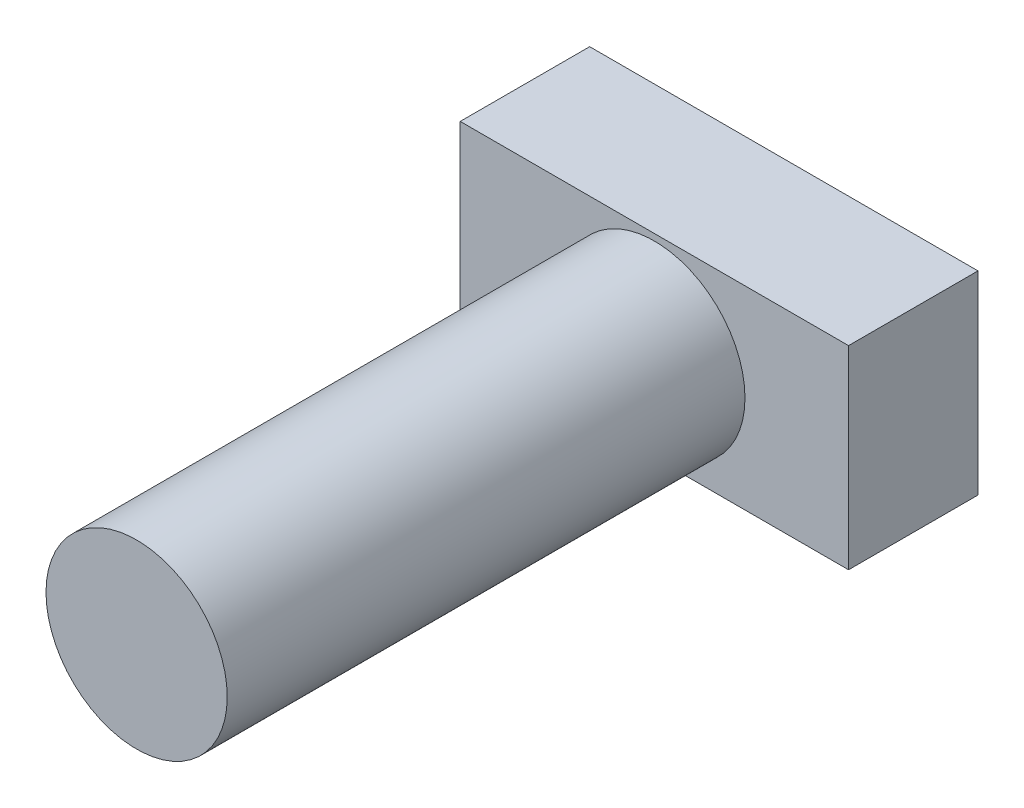
ISO-10303-21;
HEADER;
FILE_DESCRIPTION(('STEP AP214'),'2;1');
FILE_NAME('part.step','',(''),(''),'','','');
FILE_SCHEMA(('AUTOMOTIVE_DESIGN { 1 0 10303 214 1 1 1 1 }'));
ENDSEC;
DATA;
#1=APPLICATION_CONTEXT('core data for automotive mechanical design processes');
#2=APPLICATION_PROTOCOL_DEFINITION('international standard','automotive_design',2000,#1);
#3=PRODUCT_CONTEXT('',#1,'mechanical');
#4=PRODUCT('Part','Part','',(#3));
#5=PRODUCT_RELATED_PRODUCT_CATEGORY('part','',(#4));
#6=PRODUCT_DEFINITION_FORMATION('','',#4);
#7=PRODUCT_DEFINITION_CONTEXT('part definition',#1,'design');
#8=PRODUCT_DEFINITION('design','',#6,#7);
#9=PRODUCT_DEFINITION_SHAPE('','',#8);
#10=(LENGTH_UNIT() NAMED_UNIT(*) SI_UNIT(.MILLI.,.METRE.));
#11=(NAMED_UNIT(*) PLANE_ANGLE_UNIT() SI_UNIT($,.RADIAN.));
#12=(NAMED_UNIT(*) SI_UNIT($,.STERADIAN.) SOLID_ANGLE_UNIT());
#13=UNCERTAINTY_MEASURE_WITH_UNIT(LENGTH_MEASURE(1.E-05),#10,'distance_accuracy_value','');
#14=(GEOMETRIC_REPRESENTATION_CONTEXT(3) GLOBAL_UNCERTAINTY_ASSIGNED_CONTEXT((#13)) GLOBAL_UNIT_ASSIGNED_CONTEXT((#10,
#11,#12)) REPRESENTATION_CONTEXT('',''));
#15=CARTESIAN_POINT('',(0.,0.,0.));
#16=DIRECTION('',(0.,0.,1.));
#17=DIRECTION('',(1.,0.,0.));
#18=AXIS2_PLACEMENT_3D('',#15,#16,#17);
#19=CARTESIAN_POINT('',(0.,0.,40.));
#20=DIRECTION('',(0.,0.,-1.));
#21=DIRECTION('',(-1.,0.,0.));
#22=AXIS2_PLACEMENT_3D('',#19,#20,#21);
#23=CYLINDRICAL_SURFACE('',#22,7.);
#24=CARTESIAN_POINT('',(0.,0.,40.));
#25=DIRECTION('',(0.,0.,1.));
#26=DIRECTION('',(1.,0.,0.));
#27=AXIS2_PLACEMENT_3D('',#24,#25,#26);
#28=CIRCLE('',#27,7.);
#29=CARTESIAN_POINT('',(7.,0.,40.));
#30=VERTEX_POINT('',#29);
#31=EDGE_CURVE('E11',#30,#30,#28,.T.);
#32=ORIENTED_EDGE('',*,*,#31,.F.);
#33=EDGE_LOOP('',(#32));
#34=FACE_BOUND('',#33,.T.);
#35=CARTESIAN_POINT('',(0.,0.,0.));
#36=DIRECTION('',(0.,0.,1.));
#37=DIRECTION('',(1.,0.,0.));
#38=AXIS2_PLACEMENT_3D('',#35,#36,#37);
#39=CIRCLE('',#38,7.);
#40=CARTESIAN_POINT('',(7.,0.,0.));
#41=VERTEX_POINT('',#40);
#42=EDGE_CURVE('E48',#41,#41,#39,.T.);
#43=ORIENTED_EDGE('',*,*,#42,.T.);
#44=EDGE_LOOP('',(#43));
#45=FACE_BOUND('',#44,.T.);
#46=ADVANCED_FACE('F45',(#34,#45),#23,.T.);
#47=CARTESIAN_POINT('',(0.,0.,40.));
#48=DIRECTION('',(0.,0.,1.));
#49=DIRECTION('',(1.,0.,0.));
#50=AXIS2_PLACEMENT_3D('',#47,#48,#49);
#51=PLANE('',#50);
#52=ORIENTED_EDGE('',*,*,#31,.T.);
#53=EDGE_LOOP('',(#52));
#54=FACE_BOUND('',#53,.T.);
#55=ADVANCED_FACE('F154',(#54),#51,.T.);
#56=CARTESIAN_POINT('',(-15.,-7.5,-10.));
#57=DIRECTION('',(1.,0.,0.));
#58=DIRECTION('',(0.,0.,-1.));
#59=AXIS2_PLACEMENT_3D('',#56,#57,#58);
#60=PLANE('',#59);
#61=DIRECTION('',(0.,1.,0.));
#62=VECTOR('',#61,1.);
#63=CARTESIAN_POINT('',(-15.,-7.5,0.));
#64=LINE('',#63,#62);
#65=CARTESIAN_POINT('',(-15.,-7.5,0.));
#66=VERTEX_POINT('',#65);
#67=CARTESIAN_POINT('',(-15.,7.5,0.));
#68=VERTEX_POINT('',#67);
#69=EDGE_CURVE('E117',#66,#68,#64,.T.);
#70=ORIENTED_EDGE('',*,*,#69,.T.);
#71=DIRECTION('',(0.,0.,1.));
#72=VECTOR('',#71,1.);
#73=CARTESIAN_POINT('',(-15.,7.5,-10.));
#74=LINE('',#73,#72);
#75=CARTESIAN_POINT('',(-15.,7.5,-10.));
#76=VERTEX_POINT('',#75);
#77=EDGE_CURVE('E106',#76,#68,#74,.T.);
#78=ORIENTED_EDGE('',*,*,#77,.F.);
#79=DIRECTION('',(0.,1.,0.));
#80=VECTOR('',#79,1.);
#81=CARTESIAN_POINT('',(-15.,-7.5,-10.));
#82=LINE('',#81,#80);
#83=CARTESIAN_POINT('',(-15.,-7.5,-10.));
#84=VERTEX_POINT('',#83);
#85=EDGE_CURVE('E98',#84,#76,#82,.T.);
#86=ORIENTED_EDGE('',*,*,#85,.F.);
#87=DIRECTION('',(0.,0.,1.));
#88=VECTOR('',#87,1.);
#89=CARTESIAN_POINT('',(-15.,-7.5,-10.));
#90=LINE('',#89,#88);
#91=EDGE_CURVE('E113',#84,#66,#90,.T.);
#92=ORIENTED_EDGE('',*,*,#91,.T.);
#93=EDGE_LOOP('',(#70,#78,#86,#92));
#94=FACE_BOUND('',#93,.T.);
#95=ADVANCED_FACE('F143',(#94),#60,.F.);
#96=CARTESIAN_POINT('',(15.,7.5,-10.));
#97=DIRECTION('',(0.,-1.,0.));
#98=DIRECTION('',(0.,0.,-1.));
#99=AXIS2_PLACEMENT_3D('',#96,#97,#98);
#100=PLANE('',#99);
#101=DIRECTION('',(1.,0.,0.));
#102=VECTOR('',#101,1.);
#103=CARTESIAN_POINT('',(15.,7.5,0.));
#104=LINE('',#103,#102);
#105=CARTESIAN_POINT('',(15.,7.5,0.));
#106=VERTEX_POINT('',#105);
#107=EDGE_CURVE('E104',#68,#106,#104,.T.);
#108=ORIENTED_EDGE('',*,*,#107,.T.);
#109=DIRECTION('',(0.,0.,1.));
#110=VECTOR('',#109,1.);
#111=CARTESIAN_POINT('',(15.,7.5,-10.));
#112=LINE('',#111,#110);
#113=CARTESIAN_POINT('',(15.,7.5,-10.));
#114=VERTEX_POINT('',#113);
#115=EDGE_CURVE('E102',#114,#106,#112,.T.);
#116=ORIENTED_EDGE('',*,*,#115,.F.);
#117=DIRECTION('',(1.,0.,0.));
#118=VECTOR('',#117,1.);
#119=CARTESIAN_POINT('',(15.,7.5,-10.));
#120=LINE('',#119,#118);
#121=EDGE_CURVE('E93',#76,#114,#120,.T.);
#122=ORIENTED_EDGE('',*,*,#121,.F.);
#123=ORIENTED_EDGE('',*,*,#77,.T.);
#124=EDGE_LOOP('',(#108,#116,#122,#123));
#125=FACE_BOUND('',#124,.T.);
#126=ADVANCED_FACE('F103',(#125),#100,.F.);
#127=CARTESIAN_POINT('',(15.,-7.5,-10.));
#128=DIRECTION('',(-1.,0.,0.));
#129=DIRECTION('',(0.,0.,1.));
#130=AXIS2_PLACEMENT_3D('',#127,#128,#129);
#131=PLANE('',#130);
#132=DIRECTION('',(0.,-1.,0.));
#133=VECTOR('',#132,1.);
#134=CARTESIAN_POINT('',(15.,-7.5,0.));
#135=LINE('',#134,#133);
#136=CARTESIAN_POINT('',(15.,-7.5,0.));
#137=VERTEX_POINT('',#136);
#138=EDGE_CURVE('E79',#106,#137,#135,.T.);
#139=ORIENTED_EDGE('',*,*,#138,.T.);
#140=DIRECTION('',(0.,0.,1.));
#141=VECTOR('',#140,1.);
#142=CARTESIAN_POINT('',(15.,-7.5,-10.));
#143=LINE('',#142,#141);
#144=CARTESIAN_POINT('',(15.,-7.5,-10.));
#145=VERTEX_POINT('',#144);
#146=EDGE_CURVE('E107',#145,#137,#143,.T.);
#147=ORIENTED_EDGE('',*,*,#146,.F.);
#148=DIRECTION('',(0.,-1.,0.));
#149=VECTOR('',#148,1.);
#150=CARTESIAN_POINT('',(15.,-7.5,-10.));
#151=LINE('',#150,#149);
#152=EDGE_CURVE('E96',#114,#145,#151,.T.);
#153=ORIENTED_EDGE('',*,*,#152,.F.);
#154=ORIENTED_EDGE('',*,*,#115,.T.);
#155=EDGE_LOOP('',(#139,#147,#153,#154));
#156=FACE_BOUND('',#155,.T.);
#157=ADVANCED_FACE('F109',(#156),#131,.F.);
#158=CARTESIAN_POINT('',(15.,-7.5,-10.));
#159=DIRECTION('',(0.,1.,0.));
#160=DIRECTION('',(0.,0.,1.));
#161=AXIS2_PLACEMENT_3D('',#158,#159,#160);
#162=PLANE('',#161);
#163=DIRECTION('',(-1.,0.,0.));
#164=VECTOR('',#163,1.);
#165=CARTESIAN_POINT('',(15.,-7.5,0.));
#166=LINE('',#165,#164);
#167=EDGE_CURVE('E85',#137,#66,#166,.T.);
#168=ORIENTED_EDGE('',*,*,#167,.T.);
#169=ORIENTED_EDGE('',*,*,#91,.F.);
#170=DIRECTION('',(-1.,0.,0.));
#171=VECTOR('',#170,1.);
#172=CARTESIAN_POINT('',(15.,-7.5,-10.));
#173=LINE('',#172,#171);
#174=EDGE_CURVE('E62',#145,#84,#173,.T.);
#175=ORIENTED_EDGE('',*,*,#174,.F.);
#176=ORIENTED_EDGE('',*,*,#146,.T.);
#177=EDGE_LOOP('',(#168,#169,#175,#176));
#178=FACE_BOUND('',#177,.T.);
#179=ADVANCED_FACE('F144',(#178),#162,.F.);
#180=CARTESIAN_POINT('',(0.,0.,-10.));
#181=DIRECTION('',(0.,0.,1.));
#182=DIRECTION('',(1.,0.,0.));
#183=AXIS2_PLACEMENT_3D('',#180,#181,#182);
#184=PLANE('',#183);
#185=ORIENTED_EDGE('',*,*,#85,.T.);
#186=ORIENTED_EDGE('',*,*,#121,.T.);
#187=ORIENTED_EDGE('',*,*,#152,.T.);
#188=ORIENTED_EDGE('',*,*,#174,.T.);
#189=EDGE_LOOP('',(#185,#186,#187,#188));
#190=FACE_BOUND('',#189,.T.);
#191=ADVANCED_FACE('F94',(#190),#184,.F.);
#192=CARTESIAN_POINT('',(0.,0.,0.));
#193=DIRECTION('',(0.,0.,1.));
#194=DIRECTION('',(1.,0.,0.));
#195=AXIS2_PLACEMENT_3D('',#192,#193,#194);
#196=PLANE('',#195);
#197=ORIENTED_EDGE('',*,*,#42,.F.);
#198=EDGE_LOOP('',(#197));
#199=FACE_BOUND('',#198,.T.);
#200=ORIENTED_EDGE('',*,*,#69,.F.);
#201=ORIENTED_EDGE('',*,*,#167,.F.);
#202=ORIENTED_EDGE('',*,*,#138,.F.);
#203=ORIENTED_EDGE('',*,*,#107,.F.);
#204=EDGE_LOOP('',(#200,#201,#202,#203));
#205=FACE_BOUND('',#204,.T.);
#206=ADVANCED_FACE('F137',(#199,#205),#196,.T.);
#207=CLOSED_SHELL('',(#46,#55,#95,#126,#157,#179,#191,#206));
#208=MANIFOLD_SOLID_BREP('B2',#207);
#209=ADVANCED_BREP_SHAPE_REPRESENTATION('',(#18,#208),#14);
#210=SHAPE_DEFINITION_REPRESENTATION(#9,#209);
ENDSEC;
END-ISO-10303-21;
